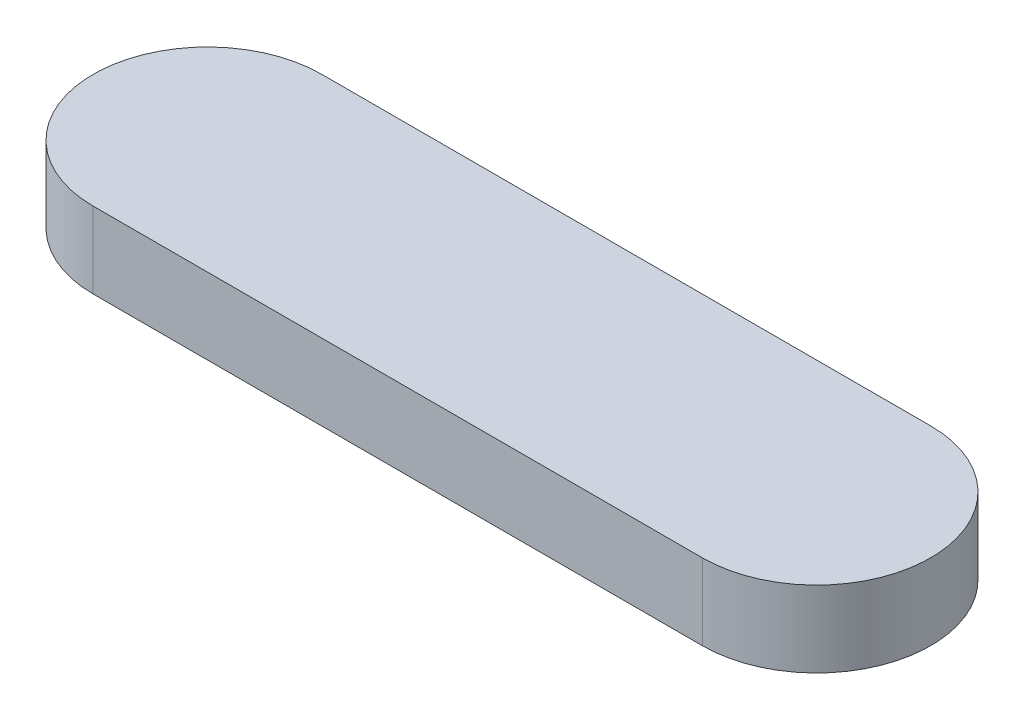
ISO-10303-21;
HEADER;
FILE_DESCRIPTION(('STEP AP214'),'2;1');
FILE_NAME('part.step','',(''),(''),'','','');
FILE_SCHEMA(('AUTOMOTIVE_DESIGN { 1 0 10303 214 1 1 1 1 }'));
ENDSEC;
DATA;
#1=APPLICATION_CONTEXT('core data for automotive mechanical design processes');
#2=APPLICATION_PROTOCOL_DEFINITION('international standard','automotive_design',2000,#1);
#3=PRODUCT_CONTEXT('',#1,'mechanical');
#4=PRODUCT('Part','Part','',(#3));
#5=PRODUCT_RELATED_PRODUCT_CATEGORY('part','',(#4));
#6=PRODUCT_DEFINITION_FORMATION('','',#4);
#7=PRODUCT_DEFINITION_CONTEXT('part definition',#1,'design');
#8=PRODUCT_DEFINITION('design','',#6,#7);
#9=PRODUCT_DEFINITION_SHAPE('','',#8);
#10=(LENGTH_UNIT() NAMED_UNIT(*) SI_UNIT(.MILLI.,.METRE.));
#11=(NAMED_UNIT(*) PLANE_ANGLE_UNIT() SI_UNIT($,.RADIAN.));
#12=(NAMED_UNIT(*) SI_UNIT($,.STERADIAN.) SOLID_ANGLE_UNIT());
#13=UNCERTAINTY_MEASURE_WITH_UNIT(LENGTH_MEASURE(1.E-05),#10,'distance_accuracy_value','');
#14=(GEOMETRIC_REPRESENTATION_CONTEXT(3) GLOBAL_UNCERTAINTY_ASSIGNED_CONTEXT((#13)) GLOBAL_UNIT_ASSIGNED_CONTEXT((#10,
#11,#12)) REPRESENTATION_CONTEXT('',''));
#15=CARTESIAN_POINT('',(0.,0.,0.));
#16=DIRECTION('',(0.,0.,1.));
#17=DIRECTION('',(1.,0.,0.));
#18=AXIS2_PLACEMENT_3D('',#15,#16,#17);
#19=CARTESIAN_POINT('',(0.,50.,0.));
#20=DIRECTION('',(0.,-1.,0.));
#21=DIRECTION('',(0.,0.,-1.));
#22=AXIS2_PLACEMENT_3D('',#19,#20,#21);
#23=CYLINDRICAL_SURFACE('',#22,75.);
#24=CARTESIAN_POINT('',(0.,0.,0.));
#25=DIRECTION('',(0.,1.,0.));
#26=DIRECTION('',(0.,0.,1.));
#27=AXIS2_PLACEMENT_3D('',#24,#25,#26);
#28=CIRCLE('',#27,75.);
#29=CARTESIAN_POINT('',(0.,0.,-75.));
#30=VERTEX_POINT('',#29);
#31=CARTESIAN_POINT('',(0.,0.,75.));
#32=VERTEX_POINT('',#31);
#33=EDGE_CURVE('E107',#30,#32,#28,.T.);
#34=ORIENTED_EDGE('',*,*,#33,.T.);
#35=DIRECTION('',(0.,-1.,0.));
#36=VECTOR('',#35,1.);
#37=CARTESIAN_POINT('',(0.,50.,75.));
#38=LINE('',#37,#36);
#39=CARTESIAN_POINT('',(0.,50.,75.));
#40=VERTEX_POINT('',#39);
#41=EDGE_CURVE('E11',#40,#32,#38,.T.);
#42=ORIENTED_EDGE('',*,*,#41,.F.);
#43=CARTESIAN_POINT('',(0.,50.,0.));
#44=DIRECTION('',(0.,1.,0.));
#45=DIRECTION('',(0.,0.,1.));
#46=AXIS2_PLACEMENT_3D('',#43,#44,#45);
#47=CIRCLE('',#46,75.);
#48=CARTESIAN_POINT('',(0.,50.,-75.));
#49=VERTEX_POINT('',#48);
#50=EDGE_CURVE('E91',#49,#40,#47,.T.);
#51=ORIENTED_EDGE('',*,*,#50,.F.);
#52=DIRECTION('',(0.,-1.,0.));
#53=VECTOR('',#52,1.);
#54=CARTESIAN_POINT('',(0.,50.,-75.));
#55=LINE('',#54,#53);
#56=EDGE_CURVE('E103',#49,#30,#55,.T.);
#57=ORIENTED_EDGE('',*,*,#56,.T.);
#58=EDGE_LOOP('',(#34,#42,#51,#57));
#59=FACE_BOUND('',#58,.T.);
#60=ADVANCED_FACE('F39',(#59),#23,.T.);
#61=CARTESIAN_POINT('',(0.,50.,75.));
#62=DIRECTION('',(0.,0.,-1.));
#63=DIRECTION('',(-1.,0.,0.));
#64=AXIS2_PLACEMENT_3D('',#61,#62,#63);
#65=PLANE('',#64);
#66=DIRECTION('',(1.,0.,0.));
#67=VECTOR('',#66,1.);
#68=CARTESIAN_POINT('',(0.,0.,75.));
#69=LINE('',#68,#67);
#70=CARTESIAN_POINT('',(400.,0.,75.));
#71=VERTEX_POINT('',#70);
#72=EDGE_CURVE('E96',#32,#71,#69,.T.);
#73=ORIENTED_EDGE('',*,*,#72,.T.);
#74=DIRECTION('',(0.,-1.,0.));
#75=VECTOR('',#74,1.);
#76=CARTESIAN_POINT('',(400.,50.,75.));
#77=LINE('',#76,#75);
#78=CARTESIAN_POINT('',(400.,50.,75.));
#79=VERTEX_POINT('',#78);
#80=EDGE_CURVE('E48',#79,#71,#77,.T.);
#81=ORIENTED_EDGE('',*,*,#80,.F.);
#82=DIRECTION('',(1.,0.,0.));
#83=VECTOR('',#82,1.);
#84=CARTESIAN_POINT('',(0.,50.,75.));
#85=LINE('',#84,#83);
#86=EDGE_CURVE('E86',#40,#79,#85,.T.);
#87=ORIENTED_EDGE('',*,*,#86,.F.);
#88=ORIENTED_EDGE('',*,*,#41,.T.);
#89=EDGE_LOOP('',(#73,#81,#87,#88));
#90=FACE_BOUND('',#89,.T.);
#91=ADVANCED_FACE('F95',(#90),#65,.F.);
#92=CARTESIAN_POINT('',(400.,50.,0.));
#93=DIRECTION('',(0.,-1.,0.));
#94=DIRECTION('',(0.,0.,-1.));
#95=AXIS2_PLACEMENT_3D('',#92,#93,#94);
#96=CYLINDRICAL_SURFACE('',#95,75.);
#97=CARTESIAN_POINT('',(400.,0.,0.));
#98=DIRECTION('',(0.,1.,0.));
#99=DIRECTION('',(0.,0.,1.));
#100=AXIS2_PLACEMENT_3D('',#97,#98,#99);
#101=CIRCLE('',#100,75.);
#102=CARTESIAN_POINT('',(400.,0.,-75.));
#103=VERTEX_POINT('',#102);
#104=EDGE_CURVE('E73',#71,#103,#101,.T.);
#105=ORIENTED_EDGE('',*,*,#104,.T.);
#106=DIRECTION('',(0.,-1.,0.));
#107=VECTOR('',#106,1.);
#108=CARTESIAN_POINT('',(400.,50.,-75.));
#109=LINE('',#108,#107);
#110=CARTESIAN_POINT('',(400.,50.,-75.));
#111=VERTEX_POINT('',#110);
#112=EDGE_CURVE('E98',#111,#103,#109,.T.);
#113=ORIENTED_EDGE('',*,*,#112,.F.);
#114=CARTESIAN_POINT('',(400.,50.,0.));
#115=DIRECTION('',(0.,1.,0.));
#116=DIRECTION('',(0.,0.,1.));
#117=AXIS2_PLACEMENT_3D('',#114,#115,#116);
#118=CIRCLE('',#117,75.);
#119=EDGE_CURVE('E89',#79,#111,#118,.T.);
#120=ORIENTED_EDGE('',*,*,#119,.F.);
#121=ORIENTED_EDGE('',*,*,#80,.T.);
#122=EDGE_LOOP('',(#105,#113,#120,#121));
#123=FACE_BOUND('',#122,.T.);
#124=ADVANCED_FACE('F99',(#123),#96,.T.);
#125=CARTESIAN_POINT('',(0.,50.,-75.));
#126=DIRECTION('',(0.,0.,1.));
#127=DIRECTION('',(1.,0.,0.));
#128=AXIS2_PLACEMENT_3D('',#125,#126,#127);
#129=PLANE('',#128);
#130=DIRECTION('',(-1.,0.,0.));
#131=VECTOR('',#130,1.);
#132=CARTESIAN_POINT('',(0.,0.,-75.));
#133=LINE('',#132,#131);
#134=EDGE_CURVE('E79',#103,#30,#133,.T.);
#135=ORIENTED_EDGE('',*,*,#134,.T.);
#136=ORIENTED_EDGE('',*,*,#56,.F.);
#137=DIRECTION('',(-1.,0.,0.));
#138=VECTOR('',#137,1.);
#139=CARTESIAN_POINT('',(0.,50.,-75.));
#140=LINE('',#139,#138);
#141=EDGE_CURVE('E56',#111,#49,#140,.T.);
#142=ORIENTED_EDGE('',*,*,#141,.F.);
#143=ORIENTED_EDGE('',*,*,#112,.T.);
#144=EDGE_LOOP('',(#135,#136,#142,#143));
#145=FACE_BOUND('',#144,.T.);
#146=ADVANCED_FACE('F120',(#145),#129,.F.);
#147=CARTESIAN_POINT('',(0.,50.,0.));
#148=DIRECTION('',(0.,1.,0.));
#149=DIRECTION('',(0.,0.,1.));
#150=AXIS2_PLACEMENT_3D('',#147,#148,#149);
#151=PLANE('',#150);
#152=ORIENTED_EDGE('',*,*,#50,.T.);
#153=ORIENTED_EDGE('',*,*,#86,.T.);
#154=ORIENTED_EDGE('',*,*,#119,.T.);
#155=ORIENTED_EDGE('',*,*,#141,.T.);
#156=EDGE_LOOP('',(#152,#153,#154,#155));
#157=FACE_BOUND('',#156,.T.);
#158=ADVANCED_FACE('F87',(#157),#151,.T.);
#159=CARTESIAN_POINT('',(0.,0.,0.));
#160=DIRECTION('',(0.,1.,0.));
#161=DIRECTION('',(0.,0.,1.));
#162=AXIS2_PLACEMENT_3D('',#159,#160,#161);
#163=PLANE('',#162);
#164=ORIENTED_EDGE('',*,*,#33,.F.);
#165=ORIENTED_EDGE('',*,*,#134,.F.);
#166=ORIENTED_EDGE('',*,*,#104,.F.);
#167=ORIENTED_EDGE('',*,*,#72,.F.);
#168=EDGE_LOOP('',(#164,#165,#166,#167));
#169=FACE_BOUND('',#168,.T.);
#170=ADVANCED_FACE('F123',(#169),#163,.F.);
#171=CLOSED_SHELL('',(#60,#91,#124,#146,#158,#170));
#172=MANIFOLD_SOLID_BREP('B2',#171);
#173=ADVANCED_BREP_SHAPE_REPRESENTATION('',(#18,#172),#14);
#174=SHAPE_DEFINITION_REPRESENTATION(#9,#173);
ENDSEC;
END-ISO-10303-21;
